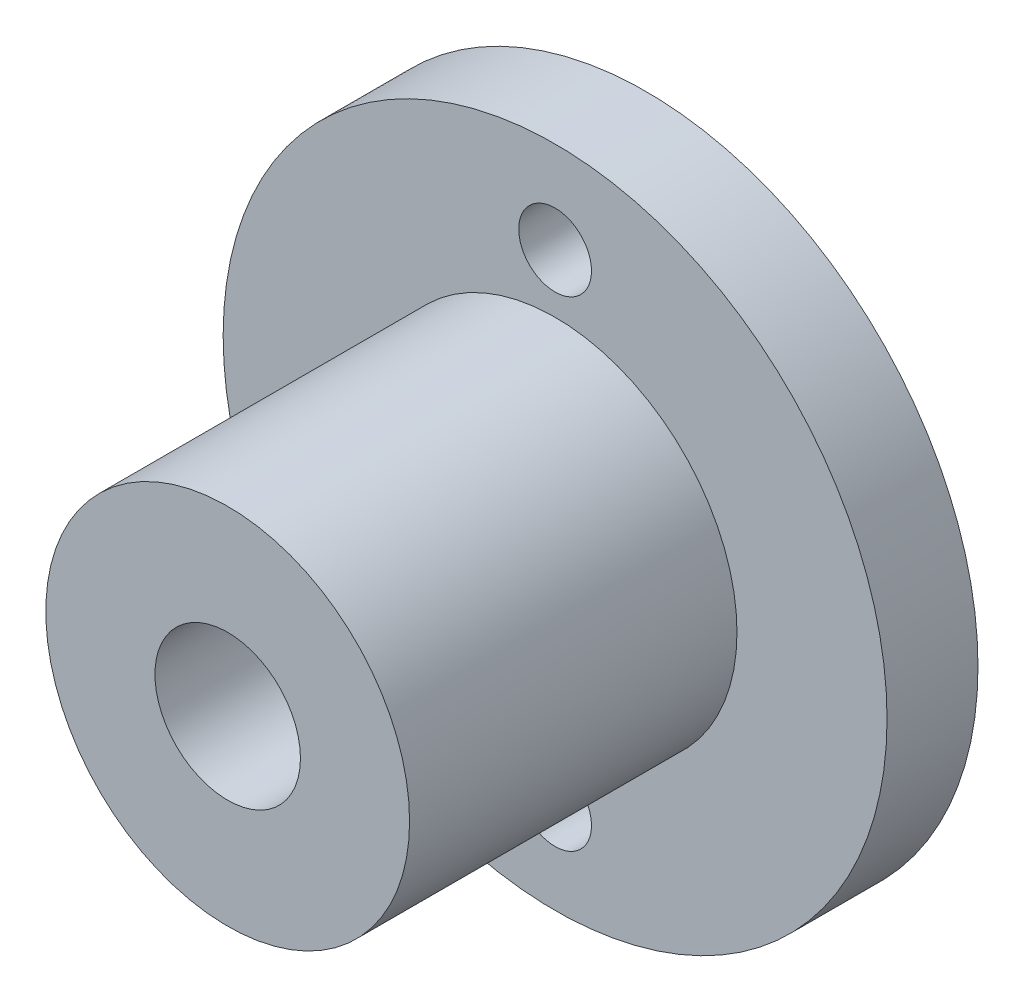
ISO-10303-21;
HEADER;
FILE_DESCRIPTION(('STEP AP214'),'2;1');
FILE_NAME('part.step','',(''),(''),'','','');
FILE_SCHEMA(('AUTOMOTIVE_DESIGN { 1 0 10303 214 1 1 1 1 }'));
ENDSEC;
DATA;
#1=APPLICATION_CONTEXT('core data for automotive mechanical design processes');
#2=APPLICATION_PROTOCOL_DEFINITION('international standard','automotive_design',2000,#1);
#3=PRODUCT_CONTEXT('',#1,'mechanical');
#4=PRODUCT('Part','Part','',(#3));
#5=PRODUCT_RELATED_PRODUCT_CATEGORY('part','',(#4));
#6=PRODUCT_DEFINITION_FORMATION('','',#4);
#7=PRODUCT_DEFINITION_CONTEXT('part definition',#1,'design');
#8=PRODUCT_DEFINITION('design','',#6,#7);
#9=PRODUCT_DEFINITION_SHAPE('','',#8);
#10=(LENGTH_UNIT() NAMED_UNIT(*) SI_UNIT(.MILLI.,.METRE.));
#11=(NAMED_UNIT(*) PLANE_ANGLE_UNIT() SI_UNIT($,.RADIAN.));
#12=(NAMED_UNIT(*) SI_UNIT($,.STERADIAN.) SOLID_ANGLE_UNIT());
#13=UNCERTAINTY_MEASURE_WITH_UNIT(LENGTH_MEASURE(1.E-05),#10,'distance_accuracy_value','');
#14=(GEOMETRIC_REPRESENTATION_CONTEXT(3) GLOBAL_UNCERTAINTY_ASSIGNED_CONTEXT((#13)) GLOBAL_UNIT_ASSIGNED_CONTEXT((#10,
#11,#12)) REPRESENTATION_CONTEXT('',''));
#15=CARTESIAN_POINT('',(0.,0.,0.));
#16=DIRECTION('',(0.,0.,1.));
#17=DIRECTION('',(1.,0.,0.));
#18=AXIS2_PLACEMENT_3D('',#15,#16,#17);
#19=CARTESIAN_POINT('',(0.,0.,-5.));
#20=DIRECTION('',(0.,0.,1.));
#21=DIRECTION('',(1.,0.,0.));
#22=AXIS2_PLACEMENT_3D('',#19,#20,#21);
#23=CYLINDRICAL_SURFACE('',#22,18.25);
#24=CARTESIAN_POINT('',(0.,0.,-5.));
#25=DIRECTION('',(0.,0.,1.));
#26=DIRECTION('',(1.,0.,0.));
#27=AXIS2_PLACEMENT_3D('',#24,#25,#26);
#28=CIRCLE('',#27,18.25);
#29=CARTESIAN_POINT('',(18.25,0.,-5.));
#30=VERTEX_POINT('',#29);
#31=EDGE_CURVE('E10',#30,#30,#28,.T.);
#32=ORIENTED_EDGE('',*,*,#31,.T.);
#33=EDGE_LOOP('',(#32));
#34=FACE_BOUND('',#33,.T.);
#35=CARTESIAN_POINT('',(0.,0.,0.));
#36=DIRECTION('',(0.,0.,1.));
#37=DIRECTION('',(1.,0.,0.));
#38=AXIS2_PLACEMENT_3D('',#35,#36,#37);
#39=CIRCLE('',#38,18.25);
#40=CARTESIAN_POINT('',(18.25,0.,0.));
#41=VERTEX_POINT('',#40);
#42=EDGE_CURVE('E34',#41,#41,#39,.T.);
#43=ORIENTED_EDGE('',*,*,#42,.F.);
#44=EDGE_LOOP('',(#43));
#45=FACE_BOUND('',#44,.T.);
#46=ADVANCED_FACE('F31',(#34,#45),#23,.T.);
#47=CARTESIAN_POINT('',(0.,0.,-5.));
#48=DIRECTION('',(0.,0.,1.));
#49=DIRECTION('',(1.,0.,0.));
#50=AXIS2_PLACEMENT_3D('',#47,#48,#49);
#51=PLANE('',#50);
#52=CARTESIAN_POINT('',(0.,0.,-5.));
#53=DIRECTION('',(0.,0.,1.));
#54=DIRECTION('',(1.,0.,0.));
#55=AXIS2_PLACEMENT_3D('',#52,#53,#54);
#56=CIRCLE('',#55,4.);
#57=CARTESIAN_POINT('',(4.,0.,-5.));
#58=VERTEX_POINT('',#57);
#59=EDGE_CURVE('E58',#58,#58,#56,.T.);
#60=ORIENTED_EDGE('',*,*,#59,.T.);
#61=EDGE_LOOP('',(#60));
#62=FACE_BOUND('',#61,.T.);
#63=CARTESIAN_POINT('',(0.,-13.2,-5.));
#64=DIRECTION('',(0.,0.,1.));
#65=DIRECTION('',(-1.,0.,0.));
#66=AXIS2_PLACEMENT_3D('',#63,#64,#65);
#67=CIRCLE('',#66,2.);
#68=CARTESIAN_POINT('',(-2.,-13.2,-5.));
#69=VERTEX_POINT('',#68);
#70=EDGE_CURVE('E46',#69,#69,#67,.T.);
#71=ORIENTED_EDGE('',*,*,#70,.T.);
#72=EDGE_LOOP('',(#71));
#73=FACE_BOUND('',#72,.T.);
#74=CARTESIAN_POINT('',(0.,13.2,-5.));
#75=DIRECTION('',(0.,0.,1.));
#76=DIRECTION('',(1.,0.,0.));
#77=AXIS2_PLACEMENT_3D('',#74,#75,#76);
#78=CIRCLE('',#77,2.);
#79=CARTESIAN_POINT('',(2.,13.2,-5.));
#80=VERTEX_POINT('',#79);
#81=EDGE_CURVE('E41',#80,#80,#78,.T.);
#82=ORIENTED_EDGE('',*,*,#81,.T.);
#83=EDGE_LOOP('',(#82));
#84=FACE_BOUND('',#83,.T.);
#85=ORIENTED_EDGE('',*,*,#31,.F.);
#86=EDGE_LOOP('',(#85));
#87=FACE_BOUND('',#86,.T.);
#88=ADVANCED_FACE('F67',(#62,#73,#84,#87),#51,.F.);
#89=CARTESIAN_POINT('',(0.,0.,0.));
#90=DIRECTION('',(0.,0.,1.));
#91=DIRECTION('',(1.,0.,0.));
#92=AXIS2_PLACEMENT_3D('',#89,#90,#91);
#93=PLANE('',#92);
#94=CARTESIAN_POINT('',(0.,0.,0.));
#95=DIRECTION('',(0.,0.,1.));
#96=DIRECTION('',(1.,0.,0.));
#97=AXIS2_PLACEMENT_3D('',#94,#95,#96);
#98=CIRCLE('',#97,10.);
#99=CARTESIAN_POINT('',(10.,0.,0.));
#100=VERTEX_POINT('',#99);
#101=EDGE_CURVE('E55',#100,#100,#98,.T.);
#102=ORIENTED_EDGE('',*,*,#101,.F.);
#103=EDGE_LOOP('',(#102));
#104=FACE_BOUND('',#103,.T.);
#105=CARTESIAN_POINT('',(0.,-13.2,0.));
#106=DIRECTION('',(0.,0.,1.));
#107=DIRECTION('',(-1.,0.,0.));
#108=AXIS2_PLACEMENT_3D('',#105,#106,#107);
#109=CIRCLE('',#108,2.);
#110=CARTESIAN_POINT('',(-2.,-13.2,0.));
#111=VERTEX_POINT('',#110);
#112=EDGE_CURVE('E49',#111,#111,#109,.T.);
#113=ORIENTED_EDGE('',*,*,#112,.F.);
#114=EDGE_LOOP('',(#113));
#115=FACE_BOUND('',#114,.T.);
#116=CARTESIAN_POINT('',(0.,13.2,0.));
#117=DIRECTION('',(0.,0.,1.));
#118=DIRECTION('',(1.,0.,0.));
#119=AXIS2_PLACEMENT_3D('',#116,#117,#118);
#120=CIRCLE('',#119,2.);
#121=CARTESIAN_POINT('',(2.,13.2,0.));
#122=VERTEX_POINT('',#121);
#123=EDGE_CURVE('E43',#122,#122,#120,.T.);
#124=ORIENTED_EDGE('',*,*,#123,.F.);
#125=EDGE_LOOP('',(#124));
#126=FACE_BOUND('',#125,.T.);
#127=ORIENTED_EDGE('',*,*,#42,.T.);
#128=EDGE_LOOP('',(#127));
#129=FACE_BOUND('',#128,.T.);
#130=ADVANCED_FACE('F89',(#104,#115,#126,#129),#93,.T.);
#131=CARTESIAN_POINT('',(0.,13.2,-5.));
#132=DIRECTION('',(0.,0.,1.));
#133=DIRECTION('',(1.,0.,0.));
#134=AXIS2_PLACEMENT_3D('',#131,#132,#133);
#135=CYLINDRICAL_SURFACE('',#134,2.);
#136=ORIENTED_EDGE('',*,*,#81,.F.);
#137=EDGE_LOOP('',(#136));
#138=FACE_BOUND('',#137,.T.);
#139=ORIENTED_EDGE('',*,*,#123,.T.);
#140=EDGE_LOOP('',(#139));
#141=FACE_BOUND('',#140,.T.);
#142=ADVANCED_FACE('F92',(#138,#141),#135,.F.);
#143=CARTESIAN_POINT('',(0.,-13.2,-5.));
#144=DIRECTION('',(0.,0.,1.));
#145=DIRECTION('',(1.,0.,0.));
#146=AXIS2_PLACEMENT_3D('',#143,#144,#145);
#147=CYLINDRICAL_SURFACE('',#146,2.);
#148=ORIENTED_EDGE('',*,*,#70,.F.);
#149=EDGE_LOOP('',(#148));
#150=FACE_BOUND('',#149,.T.);
#151=ORIENTED_EDGE('',*,*,#112,.T.);
#152=EDGE_LOOP('',(#151));
#153=FACE_BOUND('',#152,.T.);
#154=ADVANCED_FACE('F85',(#150,#153),#147,.F.);
#155=CARTESIAN_POINT('',(0.,0.,18.));
#156=DIRECTION('',(0.,0.,-1.));
#157=DIRECTION('',(-1.,0.,0.));
#158=AXIS2_PLACEMENT_3D('',#155,#156,#157);
#159=CYLINDRICAL_SURFACE('',#158,10.);
#160=CARTESIAN_POINT('',(0.,0.,18.));
#161=DIRECTION('',(0.,0.,1.));
#162=DIRECTION('',(1.,0.,0.));
#163=AXIS2_PLACEMENT_3D('',#160,#161,#162);
#164=CIRCLE('',#163,10.);
#165=CARTESIAN_POINT('',(10.,0.,18.));
#166=VERTEX_POINT('',#165);
#167=EDGE_CURVE('E52',#166,#166,#164,.T.);
#168=ORIENTED_EDGE('',*,*,#167,.F.);
#169=EDGE_LOOP('',(#168));
#170=FACE_BOUND('',#169,.T.);
#171=ORIENTED_EDGE('',*,*,#101,.T.);
#172=EDGE_LOOP('',(#171));
#173=FACE_BOUND('',#172,.T.);
#174=ADVANCED_FACE('F79',(#170,#173),#159,.T.);
#175=CARTESIAN_POINT('',(0.,0.,18.));
#176=DIRECTION('',(0.,0.,1.));
#177=DIRECTION('',(1.,0.,0.));
#178=AXIS2_PLACEMENT_3D('',#175,#176,#177);
#179=PLANE('',#178);
#180=CARTESIAN_POINT('',(0.,0.,18.));
#181=DIRECTION('',(0.,0.,1.));
#182=DIRECTION('',(1.,0.,0.));
#183=AXIS2_PLACEMENT_3D('',#180,#181,#182);
#184=CIRCLE('',#183,4.);
#185=CARTESIAN_POINT('',(4.,0.,18.));
#186=VERTEX_POINT('',#185);
#187=EDGE_CURVE('E61',#186,#186,#184,.T.);
#188=ORIENTED_EDGE('',*,*,#187,.F.);
#189=EDGE_LOOP('',(#188));
#190=FACE_BOUND('',#189,.T.);
#191=ORIENTED_EDGE('',*,*,#167,.T.);
#192=EDGE_LOOP('',(#191));
#193=FACE_BOUND('',#192,.T.);
#194=ADVANCED_FACE('F73',(#190,#193),#179,.T.);
#195=CARTESIAN_POINT('',(0.,0.,-5.));
#196=DIRECTION('',(0.,0.,1.));
#197=DIRECTION('',(1.,0.,0.));
#198=AXIS2_PLACEMENT_3D('',#195,#196,#197);
#199=CYLINDRICAL_SURFACE('',#198,4.);
#200=ORIENTED_EDGE('',*,*,#59,.F.);
#201=EDGE_LOOP('',(#200));
#202=FACE_BOUND('',#201,.T.);
#203=ORIENTED_EDGE('',*,*,#187,.T.);
#204=EDGE_LOOP('',(#203));
#205=FACE_BOUND('',#204,.T.);
#206=ADVANCED_FACE('F70',(#202,#205),#199,.F.);
#207=CLOSED_SHELL('',(#46,#88,#130,#142,#154,#174,#194,#206));
#208=MANIFOLD_SOLID_BREP('B2',#207);
#209=ADVANCED_BREP_SHAPE_REPRESENTATION('',(#18,#208),#14);
#210=SHAPE_DEFINITION_REPRESENTATION(#9,#209);
ENDSEC;
END-ISO-10303-21;
